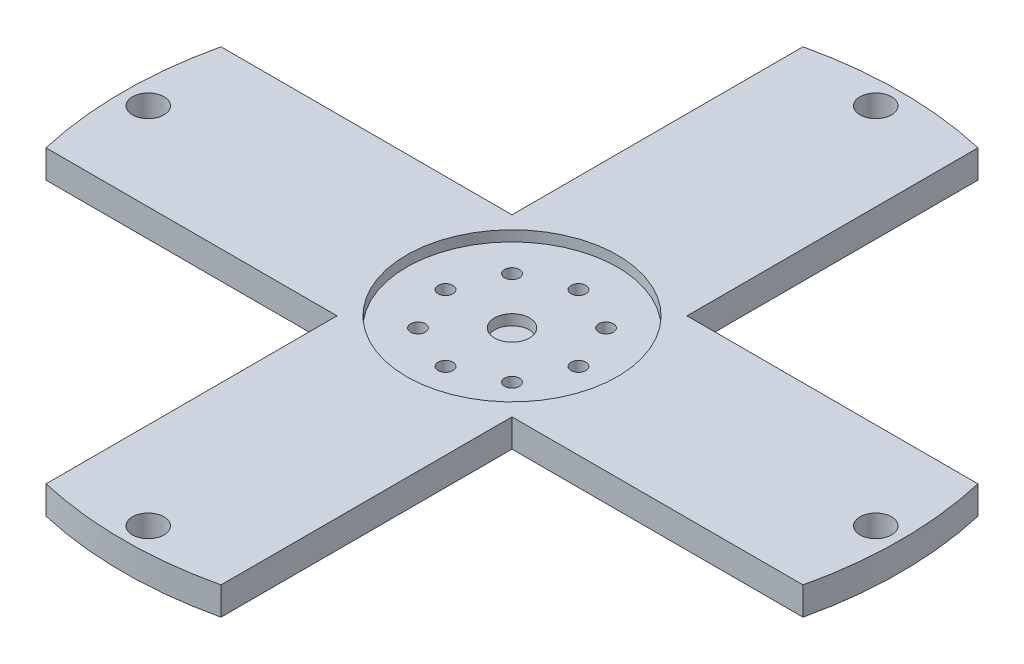
ISO-10303-21;
HEADER;
FILE_DESCRIPTION(('STEP AP214'),'2;1');
FILE_NAME('part.step','',(''),(''),'','','');
FILE_SCHEMA(('AUTOMOTIVE_DESIGN { 1 0 10303 214 1 1 1 1 }'));
ENDSEC;
DATA;
#1=APPLICATION_CONTEXT('core data for automotive mechanical design processes');
#2=APPLICATION_PROTOCOL_DEFINITION('international standard','automotive_design',2000,#1);
#3=PRODUCT_CONTEXT('',#1,'mechanical');
#4=PRODUCT('Part','Part','',(#3));
#5=PRODUCT_RELATED_PRODUCT_CATEGORY('part','',(#4));
#6=PRODUCT_DEFINITION_FORMATION('','',#4);
#7=PRODUCT_DEFINITION_CONTEXT('part definition',#1,'design');
#8=PRODUCT_DEFINITION('design','',#6,#7);
#9=PRODUCT_DEFINITION_SHAPE('','',#8);
#10=(LENGTH_UNIT() NAMED_UNIT(*) SI_UNIT(.MILLI.,.METRE.));
#11=(NAMED_UNIT(*) PLANE_ANGLE_UNIT() SI_UNIT($,.RADIAN.));
#12=(NAMED_UNIT(*) SI_UNIT($,.STERADIAN.) SOLID_ANGLE_UNIT());
#13=UNCERTAINTY_MEASURE_WITH_UNIT(LENGTH_MEASURE(1.E-05),#10,'distance_accuracy_value','');
#14=(GEOMETRIC_REPRESENTATION_CONTEXT(3) GLOBAL_UNCERTAINTY_ASSIGNED_CONTEXT((#13)) GLOBAL_UNIT_ASSIGNED_CONTEXT((#10,
#11,#12)) REPRESENTATION_CONTEXT('',''));
#15=CARTESIAN_POINT('',(0.,0.,0.));
#16=DIRECTION('',(0.,0.,1.));
#17=DIRECTION('',(1.,0.,0.));
#18=AXIS2_PLACEMENT_3D('',#15,#16,#17);
#19=CARTESIAN_POINT('',(0.,8.,-19.));
#20=DIRECTION('',(0.,-1.,0.));
#21=DIRECTION('',(0.,0.,-1.));
#22=AXIS2_PLACEMENT_3D('',#19,#20,#21);
#23=CYLINDRICAL_SURFACE('',#22,2.1);
#24=CARTESIAN_POINT('',(0.,0.,-19.));
#25=DIRECTION('',(0.,1.,0.));
#26=DIRECTION('',(0.,0.,1.));
#27=AXIS2_PLACEMENT_3D('',#24,#25,#26);
#28=CIRCLE('',#27,2.1);
#29=CARTESIAN_POINT('',(0.,0.,-16.9));
#30=VERTEX_POINT('',#29);
#31=EDGE_CURVE('E171',#30,#30,#28,.T.);
#32=ORIENTED_EDGE('',*,*,#31,.F.);
#33=EDGE_LOOP('',(#32));
#34=FACE_BOUND('',#33,.T.);
#35=CARTESIAN_POINT('',(0.,5.,-19.));
#36=DIRECTION('',(0.,1.,0.));
#37=DIRECTION('',(0.,0.,1.));
#38=AXIS2_PLACEMENT_3D('',#35,#36,#37);
#39=CIRCLE('',#38,2.1);
#40=CARTESIAN_POINT('',(0.,5.,-16.9));
#41=VERTEX_POINT('',#40);
#42=EDGE_CURVE('E540',#41,#41,#39,.T.);
#43=ORIENTED_EDGE('',*,*,#42,.T.);
#44=EDGE_LOOP('',(#43));
#45=FACE_BOUND('',#44,.T.);
#46=ADVANCED_FACE('F38',(#34,#45),#23,.F.);
#47=CARTESIAN_POINT('',(13.4350288425446,8.,-13.435028842545));
#48=DIRECTION('',(0.,-1.,0.));
#49=DIRECTION('',(0.,0.,-1.));
#50=AXIS2_PLACEMENT_3D('',#47,#48,#49);
#51=CYLINDRICAL_SURFACE('',#50,2.1000000000001);
#52=CARTESIAN_POINT('',(13.4350288425446,0.,-13.435028842545));
#53=DIRECTION('',(0.,1.,0.));
#54=DIRECTION('',(0.,0.,1.));
#55=AXIS2_PLACEMENT_3D('',#52,#53,#54);
#56=CIRCLE('',#55,2.1000000000001);
#57=CARTESIAN_POINT('',(13.4350288425446,0.,-11.3350288425449));
#58=VERTEX_POINT('',#57);
#59=EDGE_CURVE('E592',#58,#58,#56,.T.);
#60=ORIENTED_EDGE('',*,*,#59,.F.);
#61=EDGE_LOOP('',(#60));
#62=FACE_BOUND('',#61,.T.);
#63=CARTESIAN_POINT('',(13.4350288425446,5.,-13.435028842545));
#64=DIRECTION('',(0.,1.,0.));
#65=DIRECTION('',(0.,0.,1.));
#66=AXIS2_PLACEMENT_3D('',#63,#64,#65);
#67=CIRCLE('',#66,2.1000000000001);
#68=CARTESIAN_POINT('',(13.4350288425446,5.,-11.3350288425449));
#69=VERTEX_POINT('',#68);
#70=EDGE_CURVE('E536',#69,#69,#67,.T.);
#71=ORIENTED_EDGE('',*,*,#70,.T.);
#72=EDGE_LOOP('',(#71));
#73=FACE_BOUND('',#72,.T.);
#74=ADVANCED_FACE('F300',(#62,#73),#51,.F.);
#75=CARTESIAN_POINT('',(19.0000000000008,8.,-8.07691889848134E-13));
#76=DIRECTION('',(0.,-1.,0.));
#77=DIRECTION('',(0.,0.,-1.));
#78=AXIS2_PLACEMENT_3D('',#75,#76,#77);
#79=CYLINDRICAL_SURFACE('',#78,2.1000000000006);
#80=CARTESIAN_POINT('',(19.0000000000008,0.,-8.07691889848134E-13));
#81=DIRECTION('',(0.,1.,0.));
#82=DIRECTION('',(0.,0.,1.));
#83=AXIS2_PLACEMENT_3D('',#80,#81,#82);
#84=CIRCLE('',#83,2.1000000000006);
#85=CARTESIAN_POINT('',(19.0000000000008,0.,2.09999999999979));
#86=VERTEX_POINT('',#85);
#87=EDGE_CURVE('E588',#86,#86,#84,.T.);
#88=ORIENTED_EDGE('',*,*,#87,.F.);
#89=EDGE_LOOP('',(#88));
#90=FACE_BOUND('',#89,.T.);
#91=CARTESIAN_POINT('',(19.0000000000008,5.,-8.07691889848134E-13));
#92=DIRECTION('',(0.,1.,0.));
#93=DIRECTION('',(0.,0.,1.));
#94=AXIS2_PLACEMENT_3D('',#91,#92,#93);
#95=CIRCLE('',#94,2.1000000000006);
#96=CARTESIAN_POINT('',(19.0000000000008,5.,2.09999999999979));
#97=VERTEX_POINT('',#96);
#98=EDGE_CURVE('E532',#97,#97,#95,.T.);
#99=ORIENTED_EDGE('',*,*,#98,.T.);
#100=EDGE_LOOP('',(#99));
#101=FACE_BOUND('',#100,.T.);
#102=ADVANCED_FACE('F307',(#90,#101),#79,.F.);
#103=CARTESIAN_POINT('',(13.4350288425458,8.,13.4350288425438));
#104=DIRECTION('',(0.,-1.,0.));
#105=DIRECTION('',(0.,0.,-1.));
#106=AXIS2_PLACEMENT_3D('',#103,#104,#105);
#107=CYLINDRICAL_SURFACE('',#106,2.10000000000125);
#108=CARTESIAN_POINT('',(13.4350288425458,0.,13.4350288425438));
#109=DIRECTION('',(0.,1.,0.));
#110=DIRECTION('',(0.,0.,1.));
#111=AXIS2_PLACEMENT_3D('',#108,#109,#110);
#112=CIRCLE('',#111,2.10000000000125);
#113=CARTESIAN_POINT('',(13.4350288425458,0.,15.5350288425451));
#114=VERTEX_POINT('',#113);
#115=EDGE_CURVE('E584',#114,#114,#112,.T.);
#116=ORIENTED_EDGE('',*,*,#115,.F.);
#117=EDGE_LOOP('',(#116));
#118=FACE_BOUND('',#117,.T.);
#119=CARTESIAN_POINT('',(13.4350288425458,5.,13.4350288425438));
#120=DIRECTION('',(0.,1.,0.));
#121=DIRECTION('',(0.,0.,1.));
#122=AXIS2_PLACEMENT_3D('',#119,#120,#121);
#123=CIRCLE('',#122,2.10000000000125);
#124=CARTESIAN_POINT('',(13.4350288425458,5.,15.5350288425451));
#125=VERTEX_POINT('',#124);
#126=EDGE_CURVE('E528',#125,#125,#123,.T.);
#127=ORIENTED_EDGE('',*,*,#126,.T.);
#128=EDGE_LOOP('',(#127));
#129=FACE_BOUND('',#128,.T.);
#130=ADVANCED_FACE('F430',(#118,#129),#107,.F.);
#131=CARTESIAN_POINT('',(1.61538377969627E-12,8.,19.));
#132=DIRECTION('',(0.,-1.,0.));
#133=DIRECTION('',(0.,0.,-1.));
#134=AXIS2_PLACEMENT_3D('',#131,#132,#133);
#135=CYLINDRICAL_SURFACE('',#134,2.10000000000167);
#136=CARTESIAN_POINT('',(1.61538377969627E-12,0.,19.));
#137=DIRECTION('',(0.,1.,0.));
#138=DIRECTION('',(0.,0.,1.));
#139=AXIS2_PLACEMENT_3D('',#136,#137,#138);
#140=CIRCLE('',#139,2.10000000000167);
#141=CARTESIAN_POINT('',(1.61538377969627E-12,0.,21.1000000000017));
#142=VERTEX_POINT('',#141);
#143=EDGE_CURVE('E580',#142,#142,#140,.T.);
#144=ORIENTED_EDGE('',*,*,#143,.F.);
#145=EDGE_LOOP('',(#144));
#146=FACE_BOUND('',#145,.T.);
#147=CARTESIAN_POINT('',(1.61538377969627E-12,5.,19.));
#148=DIRECTION('',(0.,1.,0.));
#149=DIRECTION('',(0.,0.,1.));
#150=AXIS2_PLACEMENT_3D('',#147,#148,#149);
#151=CIRCLE('',#150,2.10000000000167);
#152=CARTESIAN_POINT('',(1.61538377969627E-12,5.,21.1000000000017));
#153=VERTEX_POINT('',#152);
#154=EDGE_CURVE('E524',#153,#153,#151,.T.);
#155=ORIENTED_EDGE('',*,*,#154,.T.);
#156=EDGE_LOOP('',(#155));
#157=FACE_BOUND('',#156,.T.);
#158=ADVANCED_FACE('F421',(#146,#157),#135,.F.);
#159=CARTESIAN_POINT('',(-13.435028842543,8.,13.435028842545));
#160=DIRECTION('',(0.,-1.,0.));
#161=DIRECTION('',(0.,0.,-1.));
#162=AXIS2_PLACEMENT_3D('',#159,#160,#161);
#163=CYLINDRICAL_SURFACE('',#162,2.10000000000164);
#164=CARTESIAN_POINT('',(-13.435028842543,0.,13.435028842545));
#165=DIRECTION('',(0.,1.,0.));
#166=DIRECTION('',(0.,0.,1.));
#167=AXIS2_PLACEMENT_3D('',#164,#165,#166);
#168=CIRCLE('',#167,2.10000000000164);
#169=CARTESIAN_POINT('',(-13.435028842543,0.,15.5350288425466));
#170=VERTEX_POINT('',#169);
#171=EDGE_CURVE('E576',#170,#170,#168,.T.);
#172=ORIENTED_EDGE('',*,*,#171,.F.);
#173=EDGE_LOOP('',(#172));
#174=FACE_BOUND('',#173,.T.);
#175=CARTESIAN_POINT('',(-13.435028842543,5.,13.435028842545));
#176=DIRECTION('',(0.,1.,0.));
#177=DIRECTION('',(0.,0.,1.));
#178=AXIS2_PLACEMENT_3D('',#175,#176,#177);
#179=CIRCLE('',#178,2.10000000000164);
#180=CARTESIAN_POINT('',(-13.435028842543,5.,15.5350288425466));
#181=VERTEX_POINT('',#180);
#182=EDGE_CURVE('E520',#181,#181,#179,.T.);
#183=ORIENTED_EDGE('',*,*,#182,.T.);
#184=EDGE_LOOP('',(#183));
#185=FACE_BOUND('',#184,.T.);
#186=ADVANCED_FACE('F412',(#174,#185),#163,.F.);
#187=CARTESIAN_POINT('',(-18.9999999999992,8.,8.10018718766514E-13));
#188=DIRECTION('',(0.,-1.,0.));
#189=DIRECTION('',(0.,0.,-1.));
#190=AXIS2_PLACEMENT_3D('',#187,#188,#189);
#191=CYLINDRICAL_SURFACE('',#190,2.1000000000012);
#192=CARTESIAN_POINT('',(-18.9999999999992,0.,8.10018718766514E-13));
#193=DIRECTION('',(0.,1.,0.));
#194=DIRECTION('',(0.,0.,1.));
#195=AXIS2_PLACEMENT_3D('',#192,#193,#194);
#196=CIRCLE('',#195,2.1000000000012);
#197=CARTESIAN_POINT('',(-18.9999999999992,0.,2.10000000000201));
#198=VERTEX_POINT('',#197);
#199=EDGE_CURVE('E572',#198,#198,#196,.T.);
#200=ORIENTED_EDGE('',*,*,#199,.F.);
#201=EDGE_LOOP('',(#200));
#202=FACE_BOUND('',#201,.T.);
#203=CARTESIAN_POINT('',(-18.9999999999992,5.,8.10018718766514E-13));
#204=DIRECTION('',(0.,1.,0.));
#205=DIRECTION('',(0.,0.,1.));
#206=AXIS2_PLACEMENT_3D('',#203,#204,#205);
#207=CIRCLE('',#206,2.1000000000012);
#208=CARTESIAN_POINT('',(-18.9999999999992,5.,2.10000000000201));
#209=VERTEX_POINT('',#208);
#210=EDGE_CURVE('E516',#209,#209,#207,.T.);
#211=ORIENTED_EDGE('',*,*,#210,.T.);
#212=EDGE_LOOP('',(#211));
#213=FACE_BOUND('',#212,.T.);
#214=ADVANCED_FACE('F403',(#202,#213),#191,.F.);
#215=CARTESIAN_POINT('',(-13.4350288425442,8.,-13.4350288425438));
#216=DIRECTION('',(0.,-1.,0.));
#217=DIRECTION('',(0.,0.,-1.));
#218=AXIS2_PLACEMENT_3D('',#215,#216,#217);
#219=CYLINDRICAL_SURFACE('',#218,2.10000000000062);
#220=CARTESIAN_POINT('',(-13.4350288425442,0.,-13.4350288425438));
#221=DIRECTION('',(0.,1.,0.));
#222=DIRECTION('',(0.,0.,1.));
#223=AXIS2_PLACEMENT_3D('',#220,#221,#222);
#224=CIRCLE('',#223,2.10000000000062);
#225=CARTESIAN_POINT('',(-13.4350288425442,0.,-11.3350288425432));
#226=VERTEX_POINT('',#225);
#227=EDGE_CURVE('E565',#226,#226,#224,.T.);
#228=ORIENTED_EDGE('',*,*,#227,.F.);
#229=EDGE_LOOP('',(#228));
#230=FACE_BOUND('',#229,.T.);
#231=CARTESIAN_POINT('',(-13.4350288425442,5.,-13.4350288425438));
#232=DIRECTION('',(0.,1.,0.));
#233=DIRECTION('',(0.,0.,1.));
#234=AXIS2_PLACEMENT_3D('',#231,#232,#233);
#235=CIRCLE('',#234,2.10000000000062);
#236=CARTESIAN_POINT('',(-13.4350288425442,5.,-11.3350288425432));
#237=VERTEX_POINT('',#236);
#238=EDGE_CURVE('E42',#237,#237,#235,.T.);
#239=ORIENTED_EDGE('',*,*,#238,.T.);
#240=EDGE_LOOP('',(#239));
#241=FACE_BOUND('',#240,.T.);
#242=ADVANCED_FACE('F314',(#230,#241),#219,.F.);
#243=CARTESIAN_POINT('',(0.,8.,0.));
#244=DIRECTION('',(0.,1.,0.));
#245=DIRECTION('',(0.,0.,1.));
#246=AXIS2_PLACEMENT_3D('',#243,#244,#245);
#247=PLANE('',#246);
#248=CARTESIAN_POINT('',(0.,8.,0.));
#249=DIRECTION('',(0.,1.,0.));
#250=DIRECTION('',(0.,0.,1.));
#251=AXIS2_PLACEMENT_3D('',#248,#249,#250);
#252=CIRCLE('',#251,30.120830341375);
#253=CARTESIAN_POINT('',(0.,8.,30.120830341375));
#254=VERTEX_POINT('',#253);
#255=EDGE_CURVE('E502',#254,#254,#252,.T.);
#256=ORIENTED_EDGE('',*,*,#255,.F.);
#257=EDGE_LOOP('',(#256));
#258=FACE_BOUND('',#257,.T.);
#259=CARTESIAN_POINT('',(5.88312999117921E-12,8.,103.945));
#260=DIRECTION('',(0.,1.,0.));
#261=DIRECTION('',(0.,0.,1.));
#262=AXIS2_PLACEMENT_3D('',#259,#260,#261);
#263=CIRCLE('',#262,4.50000000000632);
#264=CARTESIAN_POINT('',(5.88312999117921E-12,8.,108.445000000006));
#265=VERTEX_POINT('',#264);
#266=EDGE_CURVE('E553',#265,#265,#263,.T.);
#267=ORIENTED_EDGE('',*,*,#266,.F.);
#268=EDGE_LOOP('',(#267));
#269=FACE_BOUND('',#268,.T.);
#270=DIRECTION('',(0.,0.,1.));
#271=VECTOR('',#270,1.);
#272=CARTESIAN_POINT('',(-25.,8.,25.));
#273=LINE('',#272,#271);
#274=CARTESIAN_POINT('',(-25.,8.,25.));
#275=VERTEX_POINT('',#274);
#276=CARTESIAN_POINT('',(-25.,8.,108.148046676766));
#277=VERTEX_POINT('',#276);
#278=EDGE_CURVE('E201',#275,#277,#273,.T.);
#279=ORIENTED_EDGE('',*,*,#278,.T.);
#280=CARTESIAN_POINT('',(0.,8.,0.));
#281=DIRECTION('',(0.,1.,0.));
#282=DIRECTION('',(0.,0.,1.));
#283=AXIS2_PLACEMENT_3D('',#280,#281,#282);
#284=CIRCLE('',#283,111.);
#285=CARTESIAN_POINT('',(25.,8.,108.148046676766));
#286=VERTEX_POINT('',#285);
#287=EDGE_CURVE('E112',#277,#286,#284,.T.);
#288=ORIENTED_EDGE('',*,*,#287,.T.);
#289=DIRECTION('',(0.,0.,-1.));
#290=VECTOR('',#289,1.);
#291=CARTESIAN_POINT('',(25.,8.,25.));
#292=LINE('',#291,#290);
#293=CARTESIAN_POINT('',(25.,8.,25.));
#294=VERTEX_POINT('',#293);
#295=EDGE_CURVE('E239',#286,#294,#292,.T.);
#296=ORIENTED_EDGE('',*,*,#295,.T.);
#297=DIRECTION('',(1.,0.,0.));
#298=VECTOR('',#297,1.);
#299=CARTESIAN_POINT('',(25.,8.,25.));
#300=LINE('',#299,#298);
#301=CARTESIAN_POINT('',(108.148046676766,8.,25.));
#302=VERTEX_POINT('',#301);
#303=EDGE_CURVE('E259',#294,#302,#300,.T.);
#304=ORIENTED_EDGE('',*,*,#303,.T.);
#305=CARTESIAN_POINT('',(0.,8.,0.));
#306=DIRECTION('',(0.,1.,0.));
#307=DIRECTION('',(0.,0.,1.));
#308=AXIS2_PLACEMENT_3D('',#305,#306,#307);
#309=CIRCLE('',#308,111.);
#310=CARTESIAN_POINT('',(108.148046676766,8.,-25.));
#311=VERTEX_POINT('',#310);
#312=EDGE_CURVE('E255',#302,#311,#309,.T.);
#313=ORIENTED_EDGE('',*,*,#312,.T.);
#314=DIRECTION('',(-1.,0.,0.));
#315=VECTOR('',#314,1.);
#316=CARTESIAN_POINT('',(25.,8.,-25.));
#317=LINE('',#316,#315);
#318=CARTESIAN_POINT('',(25.,8.,-25.));
#319=VERTEX_POINT('',#318);
#320=EDGE_CURVE('E258',#311,#319,#317,.T.);
#321=ORIENTED_EDGE('',*,*,#320,.T.);
#322=DIRECTION('',(0.,0.,-1.));
#323=VECTOR('',#322,1.);
#324=CARTESIAN_POINT('',(25.,8.,-108.148046676766));
#325=LINE('',#324,#323);
#326=CARTESIAN_POINT('',(25.,8.,-108.148046676766));
#327=VERTEX_POINT('',#326);
#328=EDGE_CURVE('E263',#319,#327,#325,.T.);
#329=ORIENTED_EDGE('',*,*,#328,.T.);
#330=CARTESIAN_POINT('',(0.,8.,0.));
#331=DIRECTION('',(0.,1.,0.));
#332=DIRECTION('',(0.,0.,1.));
#333=AXIS2_PLACEMENT_3D('',#330,#331,#332);
#334=CIRCLE('',#333,111.);
#335=CARTESIAN_POINT('',(-25.,8.,-108.148046676766));
#336=VERTEX_POINT('',#335);
#337=EDGE_CURVE('E270',#327,#336,#334,.T.);
#338=ORIENTED_EDGE('',*,*,#337,.T.);
#339=DIRECTION('',(0.,0.,1.));
#340=VECTOR('',#339,1.);
#341=CARTESIAN_POINT('',(-25.,8.,-108.148046676766));
#342=LINE('',#341,#340);
#343=CARTESIAN_POINT('',(-25.,8.,-25.));
#344=VERTEX_POINT('',#343);
#345=EDGE_CURVE('E144',#336,#344,#342,.T.);
#346=ORIENTED_EDGE('',*,*,#345,.T.);
#347=DIRECTION('',(-1.,0.,0.));
#348=VECTOR('',#347,1.);
#349=CARTESIAN_POINT('',(-108.148046676766,8.,-25.));
#350=LINE('',#349,#348);
#351=CARTESIAN_POINT('',(-108.148046676766,8.,-25.));
#352=VERTEX_POINT('',#351);
#353=EDGE_CURVE('E137',#344,#352,#350,.T.);
#354=ORIENTED_EDGE('',*,*,#353,.T.);
#355=CARTESIAN_POINT('',(0.,8.,0.));
#356=DIRECTION('',(0.,1.,0.));
#357=DIRECTION('',(0.,0.,1.));
#358=AXIS2_PLACEMENT_3D('',#355,#356,#357);
#359=CIRCLE('',#358,111.);
#360=CARTESIAN_POINT('',(-108.148046676766,8.,25.));
#361=VERTEX_POINT('',#360);
#362=EDGE_CURVE('E142',#352,#361,#359,.T.);
#363=ORIENTED_EDGE('',*,*,#362,.T.);
#364=DIRECTION('',(1.,0.,0.));
#365=VECTOR('',#364,1.);
#366=CARTESIAN_POINT('',(-108.148046676766,8.,25.));
#367=LINE('',#366,#365);
#368=EDGE_CURVE('E57',#361,#275,#367,.T.);
#369=ORIENTED_EDGE('',*,*,#368,.T.);
#370=EDGE_LOOP('',(#279,#288,#296,#304,#313,#321,#329,#338,#346,#354,#363,#369));
#371=FACE_BOUND('',#370,.T.);
#372=CARTESIAN_POINT('',(0.,8.,-103.945));
#373=DIRECTION('',(0.,1.,0.));
#374=DIRECTION('',(0.,0.,1.));
#375=AXIS2_PLACEMENT_3D('',#372,#373,#374);
#376=CIRCLE('',#375,4.5);
#377=CARTESIAN_POINT('',(0.,8.,-99.445));
#378=VERTEX_POINT('',#377);
#379=EDGE_CURVE('E597',#378,#378,#376,.T.);
#380=ORIENTED_EDGE('',*,*,#379,.F.);
#381=EDGE_LOOP('',(#380));
#382=FACE_BOUND('',#381,.T.);
#383=CARTESIAN_POINT('',(103.945000000003,8.,-2.94156499558961E-12));
#384=DIRECTION('',(0.,1.,0.));
#385=DIRECTION('',(0.,0.,1.));
#386=AXIS2_PLACEMENT_3D('',#383,#384,#385);
#387=CIRCLE('',#386,4.50000000000231);
#388=CARTESIAN_POINT('',(103.945000000003,8.,4.49999999999937));
#389=VERTEX_POINT('',#388);
#390=EDGE_CURVE('E561',#389,#389,#387,.T.);
#391=ORIENTED_EDGE('',*,*,#390,.F.);
#392=EDGE_LOOP('',(#391));
#393=FACE_BOUND('',#392,.T.);
#394=CARTESIAN_POINT('',(-103.944999999997,8.,2.95429458674334E-12));
#395=DIRECTION('',(0.,1.,0.));
#396=DIRECTION('',(0.,0.,1.));
#397=AXIS2_PLACEMENT_3D('',#394,#395,#396);
#398=CIRCLE('',#397,4.50000000000473);
#399=CARTESIAN_POINT('',(-103.944999999997,8.,4.50000000000768));
#400=VERTEX_POINT('',#399);
#401=EDGE_CURVE('E545',#400,#400,#398,.T.);
#402=ORIENTED_EDGE('',*,*,#401,.F.);
#403=EDGE_LOOP('',(#402));
#404=FACE_BOUND('',#403,.T.);
#405=ADVANCED_FACE('F139',(#258,#269,#371,#382,#393,#404),#247,.T.);
#406=CARTESIAN_POINT('',(0.,0.,0.));
#407=DIRECTION('',(0.,1.,0.));
#408=DIRECTION('',(0.,0.,1.));
#409=AXIS2_PLACEMENT_3D('',#406,#407,#408);
#410=PLANE('',#409);
#411=DIRECTION('',(0.,0.,1.));
#412=VECTOR('',#411,1.);
#413=CARTESIAN_POINT('',(-25.,0.,25.));
#414=LINE('',#413,#412);
#415=CARTESIAN_POINT('',(-25.,0.,25.));
#416=VERTEX_POINT('',#415);
#417=CARTESIAN_POINT('',(-25.,0.,108.148046676766));
#418=VERTEX_POINT('',#417);
#419=EDGE_CURVE('E166',#416,#418,#414,.T.);
#420=ORIENTED_EDGE('',*,*,#419,.F.);
#421=DIRECTION('',(1.,0.,0.));
#422=VECTOR('',#421,1.);
#423=CARTESIAN_POINT('',(-108.148046676766,0.,25.));
#424=LINE('',#423,#422);
#425=CARTESIAN_POINT('',(-108.148046676766,0.,25.));
#426=VERTEX_POINT('',#425);
#427=EDGE_CURVE('E104',#426,#416,#424,.T.);
#428=ORIENTED_EDGE('',*,*,#427,.F.);
#429=CARTESIAN_POINT('',(0.,0.,0.));
#430=DIRECTION('',(0.,1.,0.));
#431=DIRECTION('',(0.,0.,1.));
#432=AXIS2_PLACEMENT_3D('',#429,#430,#431);
#433=CIRCLE('',#432,111.);
#434=CARTESIAN_POINT('',(-108.148046676766,0.,-25.));
#435=VERTEX_POINT('',#434);
#436=EDGE_CURVE('E98',#435,#426,#433,.T.);
#437=ORIENTED_EDGE('',*,*,#436,.F.);
#438=DIRECTION('',(-1.,0.,0.));
#439=VECTOR('',#438,1.);
#440=CARTESIAN_POINT('',(-108.148046676766,0.,-25.));
#441=LINE('',#440,#439);
#442=CARTESIAN_POINT('',(-25.,0.,-25.));
#443=VERTEX_POINT('',#442);
#444=EDGE_CURVE('E153',#443,#435,#441,.T.);
#445=ORIENTED_EDGE('',*,*,#444,.F.);
#446=DIRECTION('',(0.,0.,1.));
#447=VECTOR('',#446,1.);
#448=CARTESIAN_POINT('',(-25.,0.,-108.148046676766));
#449=LINE('',#448,#447);
#450=CARTESIAN_POINT('',(-25.,0.,-108.148046676766));
#451=VERTEX_POINT('',#450);
#452=EDGE_CURVE('E192',#451,#443,#449,.T.);
#453=ORIENTED_EDGE('',*,*,#452,.F.);
#454=CARTESIAN_POINT('',(0.,0.,0.));
#455=DIRECTION('',(0.,1.,0.));
#456=DIRECTION('',(0.,0.,1.));
#457=AXIS2_PLACEMENT_3D('',#454,#455,#456);
#458=CIRCLE('',#457,111.);
#459=CARTESIAN_POINT('',(25.,0.,-108.148046676766));
#460=VERTEX_POINT('',#459);
#461=EDGE_CURVE('E189',#460,#451,#458,.T.);
#462=ORIENTED_EDGE('',*,*,#461,.F.);
#463=DIRECTION('',(0.,0.,-1.));
#464=VECTOR('',#463,1.);
#465=CARTESIAN_POINT('',(25.,0.,-108.148046676766));
#466=LINE('',#465,#464);
#467=CARTESIAN_POINT('',(25.,0.,-25.));
#468=VERTEX_POINT('',#467);
#469=EDGE_CURVE('E186',#468,#460,#466,.T.);
#470=ORIENTED_EDGE('',*,*,#469,.F.);
#471=DIRECTION('',(-1.,0.,0.));
#472=VECTOR('',#471,1.);
#473=CARTESIAN_POINT('',(25.,0.,-25.));
#474=LINE('',#473,#472);
#475=CARTESIAN_POINT('',(108.148046676766,0.,-25.));
#476=VERTEX_POINT('',#475);
#477=EDGE_CURVE('E183',#476,#468,#474,.T.);
#478=ORIENTED_EDGE('',*,*,#477,.F.);
#479=CARTESIAN_POINT('',(0.,0.,0.));
#480=DIRECTION('',(0.,1.,0.));
#481=DIRECTION('',(0.,0.,1.));
#482=AXIS2_PLACEMENT_3D('',#479,#480,#481);
#483=CIRCLE('',#482,111.);
#484=CARTESIAN_POINT('',(108.148046676766,0.,25.));
#485=VERTEX_POINT('',#484);
#486=EDGE_CURVE('E180',#485,#476,#483,.T.);
#487=ORIENTED_EDGE('',*,*,#486,.F.);
#488=DIRECTION('',(1.,0.,0.));
#489=VECTOR('',#488,1.);
#490=CARTESIAN_POINT('',(25.,0.,25.));
#491=LINE('',#490,#489);
#492=CARTESIAN_POINT('',(25.,0.,25.));
#493=VERTEX_POINT('',#492);
#494=EDGE_CURVE('E177',#493,#485,#491,.T.);
#495=ORIENTED_EDGE('',*,*,#494,.F.);
#496=DIRECTION('',(0.,0.,-1.));
#497=VECTOR('',#496,1.);
#498=CARTESIAN_POINT('',(25.,0.,25.));
#499=LINE('',#498,#497);
#500=CARTESIAN_POINT('',(25.,0.,108.148046676766));
#501=VERTEX_POINT('',#500);
#502=EDGE_CURVE('E174',#501,#493,#499,.T.);
#503=ORIENTED_EDGE('',*,*,#502,.F.);
#504=CARTESIAN_POINT('',(0.,0.,0.));
#505=DIRECTION('',(0.,1.,0.));
#506=DIRECTION('',(0.,0.,1.));
#507=AXIS2_PLACEMENT_3D('',#504,#505,#506);
#508=CIRCLE('',#507,111.);
#509=EDGE_CURVE('E170',#418,#501,#508,.T.);
#510=ORIENTED_EDGE('',*,*,#509,.F.);
#511=EDGE_LOOP('',(#420,#428,#437,#445,#453,#462,#470,#478,#487,#495,#503,#510));
#512=FACE_BOUND('',#511,.T.);
#513=ORIENTED_EDGE('',*,*,#31,.T.);
#514=EDGE_LOOP('',(#513));
#515=FACE_BOUND('',#514,.T.);
#516=CARTESIAN_POINT('',(0.,0.,-103.945));
#517=DIRECTION('',(0.,1.,0.));
#518=DIRECTION('',(0.,0.,1.));
#519=AXIS2_PLACEMENT_3D('',#516,#517,#518);
#520=CIRCLE('',#519,4.5);
#521=CARTESIAN_POINT('',(0.,0.,-99.445));
#522=VERTEX_POINT('',#521);
#523=EDGE_CURVE('E596',#522,#522,#520,.T.);
#524=ORIENTED_EDGE('',*,*,#523,.T.);
#525=EDGE_LOOP('',(#524));
#526=FACE_BOUND('',#525,.T.);
#527=ORIENTED_EDGE('',*,*,#59,.T.);
#528=EDGE_LOOP('',(#527));
#529=FACE_BOUND('',#528,.T.);
#530=ORIENTED_EDGE('',*,*,#87,.T.);
#531=EDGE_LOOP('',(#530));
#532=FACE_BOUND('',#531,.T.);
#533=ORIENTED_EDGE('',*,*,#115,.T.);
#534=EDGE_LOOP('',(#533));
#535=FACE_BOUND('',#534,.T.);
#536=ORIENTED_EDGE('',*,*,#143,.T.);
#537=EDGE_LOOP('',(#536));
#538=FACE_BOUND('',#537,.T.);
#539=ORIENTED_EDGE('',*,*,#171,.T.);
#540=EDGE_LOOP('',(#539));
#541=FACE_BOUND('',#540,.T.);
#542=ORIENTED_EDGE('',*,*,#199,.T.);
#543=EDGE_LOOP('',(#542));
#544=FACE_BOUND('',#543,.T.);
#545=ORIENTED_EDGE('',*,*,#227,.T.);
#546=EDGE_LOOP('',(#545));
#547=FACE_BOUND('',#546,.T.);
#548=CARTESIAN_POINT('',(103.945000000003,0.,-2.94156499558961E-12));
#549=DIRECTION('',(0.,1.,0.));
#550=DIRECTION('',(0.,0.,1.));
#551=AXIS2_PLACEMENT_3D('',#548,#549,#550);
#552=CIRCLE('',#551,4.50000000000231);
#553=CARTESIAN_POINT('',(103.945000000003,0.,4.49999999999937));
#554=VERTEX_POINT('',#553);
#555=EDGE_CURVE('E557',#554,#554,#552,.T.);
#556=ORIENTED_EDGE('',*,*,#555,.T.);
#557=EDGE_LOOP('',(#556));
#558=FACE_BOUND('',#557,.T.);
#559=CARTESIAN_POINT('',(5.88312999117921E-12,0.,103.945));
#560=DIRECTION('',(0.,1.,0.));
#561=DIRECTION('',(0.,0.,1.));
#562=AXIS2_PLACEMENT_3D('',#559,#560,#561);
#563=CIRCLE('',#562,4.50000000000632);
#564=CARTESIAN_POINT('',(5.88312999117921E-12,0.,108.445000000006));
#565=VERTEX_POINT('',#564);
#566=EDGE_CURVE('E549',#565,#565,#563,.T.);
#567=ORIENTED_EDGE('',*,*,#566,.T.);
#568=EDGE_LOOP('',(#567));
#569=FACE_BOUND('',#568,.T.);
#570=CARTESIAN_POINT('',(-103.944999999997,0.,2.95429458674334E-12));
#571=DIRECTION('',(0.,1.,0.));
#572=DIRECTION('',(0.,0.,1.));
#573=AXIS2_PLACEMENT_3D('',#570,#571,#572);
#574=CIRCLE('',#573,4.50000000000473);
#575=CARTESIAN_POINT('',(-103.944999999997,0.,4.50000000000768));
#576=VERTEX_POINT('',#575);
#577=EDGE_CURVE('E544',#576,#576,#574,.T.);
#578=ORIENTED_EDGE('',*,*,#577,.T.);
#579=EDGE_LOOP('',(#578));
#580=FACE_BOUND('',#579,.T.);
#581=ADVANCED_FACE('F243',(#512,#515,#526,#529,#532,#535,#538,#541,#544,#547,#558,#569,#580),
#410,.F.);
#582=CARTESIAN_POINT('',(-25.,8.,25.));
#583=DIRECTION('',(1.,0.,0.));
#584=DIRECTION('',(0.,0.,-1.));
#585=AXIS2_PLACEMENT_3D('',#582,#583,#584);
#586=PLANE('',#585);
#587=ORIENTED_EDGE('',*,*,#419,.T.);
#588=DIRECTION('',(0.,-1.,0.));
#589=VECTOR('',#588,1.);
#590=CARTESIAN_POINT('',(-25.,8.,108.148046676766));
#591=LINE('',#590,#589);
#592=EDGE_CURVE('E11',#277,#418,#591,.T.);
#593=ORIENTED_EDGE('',*,*,#592,.F.);
#594=ORIENTED_EDGE('',*,*,#278,.F.);
#595=DIRECTION('',(0.,-1.,0.));
#596=VECTOR('',#595,1.);
#597=CARTESIAN_POINT('',(-25.,8.,25.));
#598=LINE('',#597,#596);
#599=EDGE_CURVE('E162',#275,#416,#598,.T.);
#600=ORIENTED_EDGE('',*,*,#599,.T.);
#601=EDGE_LOOP('',(#587,#593,#594,#600));
#602=FACE_BOUND('',#601,.T.);
#603=ADVANCED_FACE('F40',(#602),#586,.F.);
#604=CARTESIAN_POINT('',(0.,8.,0.));
#605=DIRECTION('',(0.,-1.,0.));
#606=DIRECTION('',(0.,0.,-1.));
#607=AXIS2_PLACEMENT_3D('',#604,#605,#606);
#608=CYLINDRICAL_SURFACE('',#607,111.);
#609=ORIENTED_EDGE('',*,*,#509,.T.);
#610=DIRECTION('',(0.,-1.,0.));
#611=VECTOR('',#610,1.);
#612=CARTESIAN_POINT('',(25.,8.,108.148046676766));
#613=LINE('',#612,#611);
#614=EDGE_CURVE('E49',#286,#501,#613,.T.);
#615=ORIENTED_EDGE('',*,*,#614,.F.);
#616=ORIENTED_EDGE('',*,*,#287,.F.);
#617=ORIENTED_EDGE('',*,*,#592,.T.);
#618=EDGE_LOOP('',(#609,#615,#616,#617));
#619=FACE_BOUND('',#618,.T.);
#620=ADVANCED_FACE('F321',(#619),#608,.T.);
#621=CARTESIAN_POINT('',(25.,8.,25.));
#622=DIRECTION('',(-1.,0.,0.));
#623=DIRECTION('',(0.,0.,1.));
#624=AXIS2_PLACEMENT_3D('',#621,#622,#623);
#625=PLANE('',#624);
#626=ORIENTED_EDGE('',*,*,#502,.T.);
#627=DIRECTION('',(0.,-1.,0.));
#628=VECTOR('',#627,1.);
#629=CARTESIAN_POINT('',(25.,8.,25.));
#630=LINE('',#629,#628);
#631=EDGE_CURVE('E228',#294,#493,#630,.T.);
#632=ORIENTED_EDGE('',*,*,#631,.F.);
#633=ORIENTED_EDGE('',*,*,#295,.F.);
#634=ORIENTED_EDGE('',*,*,#614,.T.);
#635=EDGE_LOOP('',(#626,#632,#633,#634));
#636=FACE_BOUND('',#635,.T.);
#637=ADVANCED_FACE('F237',(#636),#625,.F.);
#638=CARTESIAN_POINT('',(25.,8.,25.));
#639=DIRECTION('',(0.,0.,-1.));
#640=DIRECTION('',(-1.,0.,0.));
#641=AXIS2_PLACEMENT_3D('',#638,#639,#640);
#642=PLANE('',#641);
#643=ORIENTED_EDGE('',*,*,#494,.T.);
#644=DIRECTION('',(0.,-1.,0.));
#645=VECTOR('',#644,1.);
#646=CARTESIAN_POINT('',(108.148046676766,8.,25.));
#647=LINE('',#646,#645);
#648=EDGE_CURVE('E224',#302,#485,#647,.T.);
#649=ORIENTED_EDGE('',*,*,#648,.F.);
#650=ORIENTED_EDGE('',*,*,#303,.F.);
#651=ORIENTED_EDGE('',*,*,#631,.T.);
#652=EDGE_LOOP('',(#643,#649,#650,#651));
#653=FACE_BOUND('',#652,.T.);
#654=ADVANCED_FACE('F249',(#653),#642,.F.);
#655=CARTESIAN_POINT('',(0.,8.,0.));
#656=DIRECTION('',(0.,-1.,0.));
#657=DIRECTION('',(0.,0.,-1.));
#658=AXIS2_PLACEMENT_3D('',#655,#656,#657);
#659=CYLINDRICAL_SURFACE('',#658,111.);
#660=ORIENTED_EDGE('',*,*,#486,.T.);
#661=DIRECTION('',(0.,-1.,0.));
#662=VECTOR('',#661,1.);
#663=CARTESIAN_POINT('',(108.148046676766,8.,-25.));
#664=LINE('',#663,#662);
#665=EDGE_CURVE('E220',#311,#476,#664,.T.);
#666=ORIENTED_EDGE('',*,*,#665,.F.);
#667=ORIENTED_EDGE('',*,*,#312,.F.);
#668=ORIENTED_EDGE('',*,*,#648,.T.);
#669=EDGE_LOOP('',(#660,#666,#667,#668));
#670=FACE_BOUND('',#669,.T.);
#671=ADVANCED_FACE('F253',(#670),#659,.T.);
#672=CARTESIAN_POINT('',(25.,8.,-25.));
#673=DIRECTION('',(0.,0.,1.));
#674=DIRECTION('',(1.,0.,0.));
#675=AXIS2_PLACEMENT_3D('',#672,#673,#674);
#676=PLANE('',#675);
#677=ORIENTED_EDGE('',*,*,#477,.T.);
#678=DIRECTION('',(0.,-1.,0.));
#679=VECTOR('',#678,1.);
#680=CARTESIAN_POINT('',(25.,8.,-25.));
#681=LINE('',#680,#679);
#682=EDGE_CURVE('E216',#319,#468,#681,.T.);
#683=ORIENTED_EDGE('',*,*,#682,.F.);
#684=ORIENTED_EDGE('',*,*,#320,.F.);
#685=ORIENTED_EDGE('',*,*,#665,.T.);
#686=EDGE_LOOP('',(#677,#683,#684,#685));
#687=FACE_BOUND('',#686,.T.);
#688=ADVANCED_FACE('F334',(#687),#676,.F.);
#689=CARTESIAN_POINT('',(25.,8.,-108.148046676766));
#690=DIRECTION('',(-1.,0.,0.));
#691=DIRECTION('',(0.,0.,1.));
#692=AXIS2_PLACEMENT_3D('',#689,#690,#691);
#693=PLANE('',#692);
#694=ORIENTED_EDGE('',*,*,#469,.T.);
#695=DIRECTION('',(0.,-1.,0.));
#696=VECTOR('',#695,1.);
#697=CARTESIAN_POINT('',(25.,8.,-108.148046676766));
#698=LINE('',#697,#696);
#699=EDGE_CURVE('E212',#327,#460,#698,.T.);
#700=ORIENTED_EDGE('',*,*,#699,.F.);
#701=ORIENTED_EDGE('',*,*,#328,.F.);
#702=ORIENTED_EDGE('',*,*,#682,.T.);
#703=EDGE_LOOP('',(#694,#700,#701,#702));
#704=FACE_BOUND('',#703,.T.);
#705=ADVANCED_FACE('F337',(#704),#693,.F.);
#706=CARTESIAN_POINT('',(0.,8.,0.));
#707=DIRECTION('',(0.,-1.,0.));
#708=DIRECTION('',(0.,0.,-1.));
#709=AXIS2_PLACEMENT_3D('',#706,#707,#708);
#710=CYLINDRICAL_SURFACE('',#709,111.);
#711=ORIENTED_EDGE('',*,*,#461,.T.);
#712=DIRECTION('',(0.,-1.,0.));
#713=VECTOR('',#712,1.);
#714=CARTESIAN_POINT('',(-25.,8.,-108.148046676766));
#715=LINE('',#714,#713);
#716=EDGE_CURVE('E208',#336,#451,#715,.T.);
#717=ORIENTED_EDGE('',*,*,#716,.F.);
#718=ORIENTED_EDGE('',*,*,#337,.F.);
#719=ORIENTED_EDGE('',*,*,#699,.T.);
#720=EDGE_LOOP('',(#711,#717,#718,#719));
#721=FACE_BOUND('',#720,.T.);
#722=ADVANCED_FACE('F278',(#721),#710,.T.);
#723=CARTESIAN_POINT('',(-25.,8.,-108.148046676766));
#724=DIRECTION('',(1.,0.,0.));
#725=DIRECTION('',(0.,0.,-1.));
#726=AXIS2_PLACEMENT_3D('',#723,#724,#725);
#727=PLANE('',#726);
#728=ORIENTED_EDGE('',*,*,#452,.T.);
#729=DIRECTION('',(0.,-1.,0.));
#730=VECTOR('',#729,1.);
#731=CARTESIAN_POINT('',(-25.,8.,-25.));
#732=LINE('',#731,#730);
#733=EDGE_CURVE('E155',#344,#443,#732,.T.);
#734=ORIENTED_EDGE('',*,*,#733,.F.);
#735=ORIENTED_EDGE('',*,*,#345,.F.);
#736=ORIENTED_EDGE('',*,*,#716,.T.);
#737=EDGE_LOOP('',(#728,#734,#735,#736));
#738=FACE_BOUND('',#737,.T.);
#739=ADVANCED_FACE('F282',(#738),#727,.F.);
#740=CARTESIAN_POINT('',(-108.148046676766,8.,-25.));
#741=DIRECTION('',(0.,0.,1.));
#742=DIRECTION('',(1.,0.,0.));
#743=AXIS2_PLACEMENT_3D('',#740,#741,#742);
#744=PLANE('',#743);
#745=ORIENTED_EDGE('',*,*,#444,.T.);
#746=DIRECTION('',(0.,-1.,0.));
#747=VECTOR('',#746,1.);
#748=CARTESIAN_POINT('',(-108.148046676766,8.,-25.));
#749=LINE('',#748,#747);
#750=EDGE_CURVE('E150',#352,#435,#749,.T.);
#751=ORIENTED_EDGE('',*,*,#750,.F.);
#752=ORIENTED_EDGE('',*,*,#353,.F.);
#753=ORIENTED_EDGE('',*,*,#733,.T.);
#754=EDGE_LOOP('',(#745,#751,#752,#753));
#755=FACE_BOUND('',#754,.T.);
#756=ADVANCED_FACE('F151',(#755),#744,.F.);
#757=CARTESIAN_POINT('',(0.,8.,0.));
#758=DIRECTION('',(0.,-1.,0.));
#759=DIRECTION('',(0.,0.,-1.));
#760=AXIS2_PLACEMENT_3D('',#757,#758,#759);
#761=CYLINDRICAL_SURFACE('',#760,111.);
#762=ORIENTED_EDGE('',*,*,#436,.T.);
#763=DIRECTION('',(0.,-1.,0.));
#764=VECTOR('',#763,1.);
#765=CARTESIAN_POINT('',(-108.148046676766,8.,25.));
#766=LINE('',#765,#764);
#767=EDGE_CURVE('E156',#361,#426,#766,.T.);
#768=ORIENTED_EDGE('',*,*,#767,.F.);
#769=ORIENTED_EDGE('',*,*,#362,.F.);
#770=ORIENTED_EDGE('',*,*,#750,.T.);
#771=EDGE_LOOP('',(#762,#768,#769,#770));
#772=FACE_BOUND('',#771,.T.);
#773=ADVANCED_FACE('F158',(#772),#761,.T.);
#774=CARTESIAN_POINT('',(-108.148046676766,8.,25.));
#775=DIRECTION('',(0.,0.,-1.));
#776=DIRECTION('',(-1.,0.,0.));
#777=AXIS2_PLACEMENT_3D('',#774,#775,#776);
#778=PLANE('',#777);
#779=ORIENTED_EDGE('',*,*,#427,.T.);
#780=ORIENTED_EDGE('',*,*,#599,.F.);
#781=ORIENTED_EDGE('',*,*,#368,.F.);
#782=ORIENTED_EDGE('',*,*,#767,.T.);
#783=EDGE_LOOP('',(#779,#780,#781,#782));
#784=FACE_BOUND('',#783,.T.);
#785=ADVANCED_FACE('F286',(#784),#778,.F.);
#786=CARTESIAN_POINT('',(0.,8.,-103.945));
#787=DIRECTION('',(0.,-1.,0.));
#788=DIRECTION('',(0.,0.,-1.));
#789=AXIS2_PLACEMENT_3D('',#786,#787,#788);
#790=CYLINDRICAL_SURFACE('',#789,4.5);
#791=ORIENTED_EDGE('',*,*,#379,.T.);
#792=EDGE_LOOP('',(#791));
#793=FACE_BOUND('',#792,.T.);
#794=ORIENTED_EDGE('',*,*,#523,.F.);
#795=EDGE_LOOP('',(#794));
#796=FACE_BOUND('',#795,.T.);
#797=ADVANCED_FACE('F288',(#793,#796),#790,.F.);
#798=CARTESIAN_POINT('',(103.945000000003,8.,-2.94156499558961E-12));
#799=DIRECTION('',(0.,-1.,0.));
#800=DIRECTION('',(0.,0.,-1.));
#801=AXIS2_PLACEMENT_3D('',#798,#799,#800);
#802=CYLINDRICAL_SURFACE('',#801,4.50000000000231);
#803=ORIENTED_EDGE('',*,*,#390,.T.);
#804=EDGE_LOOP('',(#803));
#805=FACE_BOUND('',#804,.T.);
#806=ORIENTED_EDGE('',*,*,#555,.F.);
#807=EDGE_LOOP('',(#806));
#808=FACE_BOUND('',#807,.T.);
#809=ADVANCED_FACE('F294',(#805,#808),#802,.F.);
#810=CARTESIAN_POINT('',(5.88312999117921E-12,8.,103.945));
#811=DIRECTION('',(0.,-1.,0.));
#812=DIRECTION('',(0.,0.,-1.));
#813=AXIS2_PLACEMENT_3D('',#810,#811,#812);
#814=CYLINDRICAL_SURFACE('',#813,4.50000000000632);
#815=ORIENTED_EDGE('',*,*,#266,.T.);
#816=EDGE_LOOP('',(#815));
#817=FACE_BOUND('',#816,.T.);
#818=ORIENTED_EDGE('',*,*,#566,.F.);
#819=EDGE_LOOP('',(#818));
#820=FACE_BOUND('',#819,.T.);
#821=ADVANCED_FACE('F374',(#817,#820),#814,.F.);
#822=CARTESIAN_POINT('',(-103.944999999997,8.,2.95429458674334E-12));
#823=DIRECTION('',(0.,-1.,0.));
#824=DIRECTION('',(0.,0.,-1.));
#825=AXIS2_PLACEMENT_3D('',#822,#823,#824);
#826=CYLINDRICAL_SURFACE('',#825,4.50000000000473);
#827=ORIENTED_EDGE('',*,*,#401,.T.);
#828=EDGE_LOOP('',(#827));
#829=FACE_BOUND('',#828,.T.);
#830=ORIENTED_EDGE('',*,*,#577,.F.);
#831=EDGE_LOOP('',(#830));
#832=FACE_BOUND('',#831,.T.);
#833=ADVANCED_FACE('F383',(#829,#832),#826,.F.);
#834=CARTESIAN_POINT('',(0.,5.,0.));
#835=DIRECTION('',(0.,1.,0.));
#836=DIRECTION('',(0.,0.,1.));
#837=AXIS2_PLACEMENT_3D('',#834,#835,#836);
#838=CYLINDRICAL_SURFACE('',#837,30.120830341375);
#839=CARTESIAN_POINT('',(0.,5.,0.));
#840=DIRECTION('',(0.,1.,0.));
#841=DIRECTION('',(0.,0.,1.));
#842=AXIS2_PLACEMENT_3D('',#839,#840,#841);
#843=CIRCLE('',#842,30.120830341375);
#844=CARTESIAN_POINT('',(0.,5.,30.120830341375));
#845=VERTEX_POINT('',#844);
#846=EDGE_CURVE('E508',#845,#845,#843,.T.);
#847=ORIENTED_EDGE('',*,*,#846,.F.);
#848=EDGE_LOOP('',(#847));
#849=FACE_BOUND('',#848,.T.);
#850=ORIENTED_EDGE('',*,*,#255,.T.);
#851=EDGE_LOOP('',(#850));
#852=FACE_BOUND('',#851,.T.);
#853=ADVANCED_FACE('F392',(#849,#852),#838,.F.);
#854=CARTESIAN_POINT('',(0.,5.,0.));
#855=DIRECTION('',(0.,1.,0.));
#856=DIRECTION('',(0.,0.,1.));
#857=AXIS2_PLACEMENT_3D('',#854,#855,#856);
#858=PLANE('',#857);
#859=CARTESIAN_POINT('',(0.,5.,0.));
#860=DIRECTION('',(0.,1.,0.));
#861=DIRECTION('',(0.,0.,1.));
#862=AXIS2_PLACEMENT_3D('',#859,#860,#861);
#863=CIRCLE('',#862,5.);
#864=CARTESIAN_POINT('',(0.,5.,5.));
#865=VERTEX_POINT('',#864);
#866=EDGE_CURVE('E503',#865,#865,#863,.T.);
#867=ORIENTED_EDGE('',*,*,#866,.F.);
#868=EDGE_LOOP('',(#867));
#869=FACE_BOUND('',#868,.T.);
#870=ORIENTED_EDGE('',*,*,#42,.F.);
#871=EDGE_LOOP('',(#870));
#872=FACE_BOUND('',#871,.T.);
#873=ORIENTED_EDGE('',*,*,#70,.F.);
#874=EDGE_LOOP('',(#873));
#875=FACE_BOUND('',#874,.T.);
#876=ORIENTED_EDGE('',*,*,#98,.F.);
#877=EDGE_LOOP('',(#876));
#878=FACE_BOUND('',#877,.T.);
#879=ORIENTED_EDGE('',*,*,#126,.F.);
#880=EDGE_LOOP('',(#879));
#881=FACE_BOUND('',#880,.T.);
#882=ORIENTED_EDGE('',*,*,#154,.F.);
#883=EDGE_LOOP('',(#882));
#884=FACE_BOUND('',#883,.T.);
#885=ORIENTED_EDGE('',*,*,#182,.F.);
#886=EDGE_LOOP('',(#885));
#887=FACE_BOUND('',#886,.T.);
#888=ORIENTED_EDGE('',*,*,#210,.F.);
#889=EDGE_LOOP('',(#888));
#890=FACE_BOUND('',#889,.T.);
#891=ORIENTED_EDGE('',*,*,#238,.F.);
#892=EDGE_LOOP('',(#891));
#893=FACE_BOUND('',#892,.T.);
#894=ORIENTED_EDGE('',*,*,#846,.T.);
#895=EDGE_LOOP('',(#894));
#896=FACE_BOUND('',#895,.T.);
#897=ADVANCED_FACE('F464',(#869,#872,#875,#878,#881,#884,#887,#890,#893,#896),#858,.T.);
#898=CARTESIAN_POINT('',(0.,2.,0.));
#899=DIRECTION('',(0.,1.,0.));
#900=DIRECTION('',(0.,0.,1.));
#901=AXIS2_PLACEMENT_3D('',#898,#899,#900);
#902=CYLINDRICAL_SURFACE('',#901,5.);
#903=CARTESIAN_POINT('',(0.,2.,0.));
#904=DIRECTION('',(0.,1.,0.));
#905=DIRECTION('',(0.,0.,1.));
#906=AXIS2_PLACEMENT_3D('',#903,#904,#905);
#907=CIRCLE('',#906,5.);
#908=CARTESIAN_POINT('',(0.,2.,5.));
#909=VERTEX_POINT('',#908);
#910=EDGE_CURVE('E500',#909,#909,#907,.T.);
#911=ORIENTED_EDGE('',*,*,#910,.F.);
#912=EDGE_LOOP('',(#911));
#913=FACE_BOUND('',#912,.T.);
#914=ORIENTED_EDGE('',*,*,#866,.T.);
#915=EDGE_LOOP('',(#914));
#916=FACE_BOUND('',#915,.T.);
#917=ADVANCED_FACE('F471',(#913,#916),#902,.F.);
#918=CARTESIAN_POINT('',(0.,2.,0.));
#919=DIRECTION('',(0.,1.,0.));
#920=DIRECTION('',(0.,0.,1.));
#921=AXIS2_PLACEMENT_3D('',#918,#919,#920);
#922=PLANE('',#921);
#923=ORIENTED_EDGE('',*,*,#910,.T.);
#924=EDGE_LOOP('',(#923));
#925=FACE_BOUND('',#924,.T.);
#926=ADVANCED_FACE('F479',(#925),#922,.T.);
#927=CLOSED_SHELL('',(#46,#74,#102,#130,#158,#186,#214,#242,#405,#581,#603,#620,#637,#654,#671,
#688,#705,#722,#739,#756,#773,#785,#797,#809,#821,#833,#853,#897,#917,#926));
#928=MANIFOLD_SOLID_BREP('B2',#927);
#929=ADVANCED_BREP_SHAPE_REPRESENTATION('',(#18,#928),#14);
#930=SHAPE_DEFINITION_REPRESENTATION(#9,#929);
ENDSEC;
END-ISO-10303-21;
